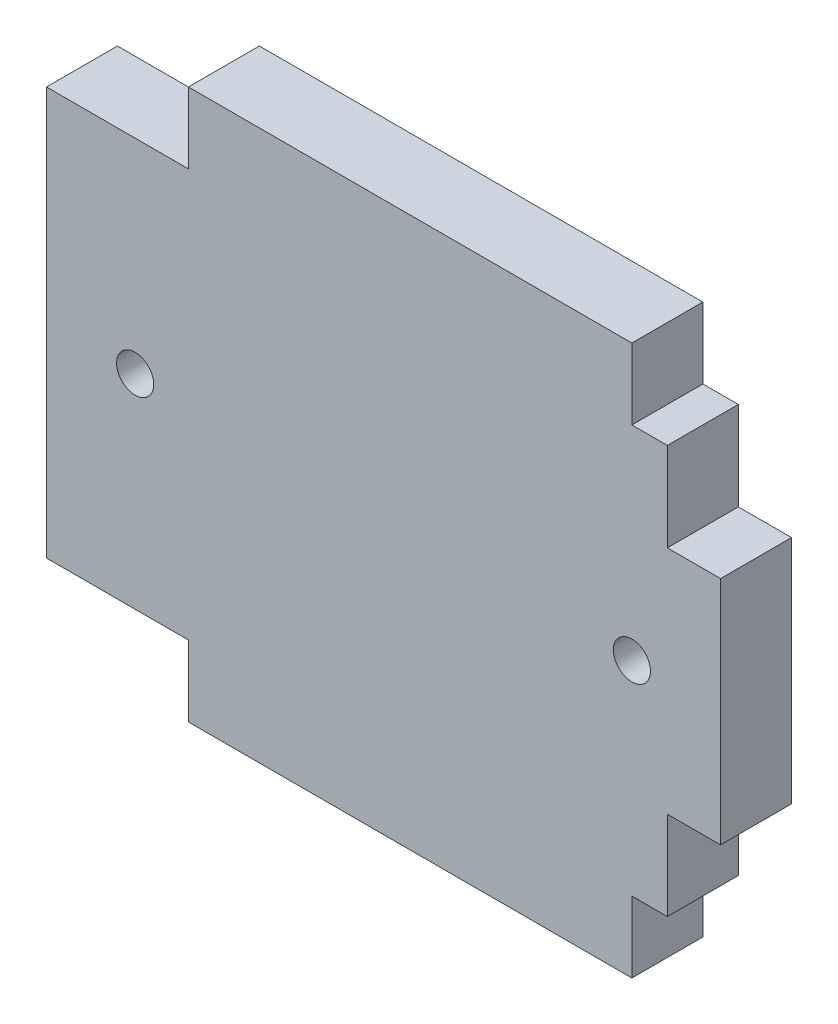
ISO-10303-21;
HEADER;
FILE_DESCRIPTION(('STEP AP214'),'2;1');
FILE_NAME('part.step','',(''),(''),'','','');
FILE_SCHEMA(('AUTOMOTIVE_DESIGN { 1 0 10303 214 1 1 1 1 }'));
ENDSEC;
DATA;
#1=APPLICATION_CONTEXT('core data for automotive mechanical design processes');
#2=APPLICATION_PROTOCOL_DEFINITION('international standard','automotive_design',2000,#1);
#3=PRODUCT_CONTEXT('',#1,'mechanical');
#4=PRODUCT('Part','Part','',(#3));
#5=PRODUCT_RELATED_PRODUCT_CATEGORY('part','',(#4));
#6=PRODUCT_DEFINITION_FORMATION('','',#4);
#7=PRODUCT_DEFINITION_CONTEXT('part definition',#1,'design');
#8=PRODUCT_DEFINITION('design','',#6,#7);
#9=PRODUCT_DEFINITION_SHAPE('','',#8);
#10=(LENGTH_UNIT() NAMED_UNIT(*) SI_UNIT(.MILLI.,.METRE.));
#11=(NAMED_UNIT(*) PLANE_ANGLE_UNIT() SI_UNIT($,.RADIAN.));
#12=(NAMED_UNIT(*) SI_UNIT($,.STERADIAN.) SOLID_ANGLE_UNIT());
#13=UNCERTAINTY_MEASURE_WITH_UNIT(LENGTH_MEASURE(1.E-05),#10,'distance_accuracy_value','');
#14=(GEOMETRIC_REPRESENTATION_CONTEXT(3) GLOBAL_UNCERTAINTY_ASSIGNED_CONTEXT((#13)) GLOBAL_UNIT_ASSIGNED_CONTEXT((#10,
#11,#12)) REPRESENTATION_CONTEXT('',''));
#15=CARTESIAN_POINT('',(0.,0.,0.));
#16=DIRECTION('',(0.,0.,1.));
#17=DIRECTION('',(1.,0.,0.));
#18=AXIS2_PLACEMENT_3D('',#15,#16,#17);
#19=CARTESIAN_POINT('',(-34.9999999999771,0.,4.));
#20=DIRECTION('',(1.,0.,0.));
#21=DIRECTION('',(0.,0.,-1.));
#22=AXIS2_PLACEMENT_3D('',#19,#20,#21);
#23=PLANE('',#22);
#24=DIRECTION('',(0.,-1.,0.));
#25=VECTOR('',#24,1.);
#26=CARTESIAN_POINT('',(-34.9999999999771,0.,0.));
#27=LINE('',#26,#25);
#28=CARTESIAN_POINT('',(-34.9999999999771,0.,0.));
#29=VERTEX_POINT('',#28);
#30=CARTESIAN_POINT('',(-34.9999999999771,-4.00000000000001,0.));
#31=VERTEX_POINT('',#30);
#32=EDGE_CURVE('E179',#29,#31,#27,.T.);
#33=ORIENTED_EDGE('',*,*,#32,.T.);
#34=DIRECTION('',(0.,0.,-1.));
#35=VECTOR('',#34,1.);
#36=CARTESIAN_POINT('',(-34.9999999999771,-4.00000000000001,4.));
#37=LINE('',#36,#35);
#38=CARTESIAN_POINT('',(-34.9999999999771,-4.00000000000001,4.));
#39=VERTEX_POINT('',#38);
#40=EDGE_CURVE('E11',#39,#31,#37,.T.);
#41=ORIENTED_EDGE('',*,*,#40,.F.);
#42=DIRECTION('',(0.,-1.,0.));
#43=VECTOR('',#42,1.);
#44=CARTESIAN_POINT('',(-34.9999999999771,0.,4.));
#45=LINE('',#44,#43);
#46=CARTESIAN_POINT('',(-34.9999999999771,0.,4.));
#47=VERTEX_POINT('',#46);
#48=EDGE_CURVE('E218',#47,#39,#45,.T.);
#49=ORIENTED_EDGE('',*,*,#48,.F.);
#50=DIRECTION('',(0.,0.,-1.));
#51=VECTOR('',#50,1.);
#52=CARTESIAN_POINT('',(-34.9999999999771,0.,4.));
#53=LINE('',#52,#51);
#54=EDGE_CURVE('E49',#47,#29,#53,.T.);
#55=ORIENTED_EDGE('',*,*,#54,.T.);
#56=EDGE_LOOP('',(#33,#41,#49,#55));
#57=FACE_BOUND('',#56,.T.);
#58=ADVANCED_FACE('F33',(#57),#23,.F.);
#59=CARTESIAN_POINT('',(-34.9999999999771,-4.00000000000001,4.));
#60=DIRECTION('',(0.,-1.,0.));
#61=DIRECTION('',(1.,0.,0.));
#62=AXIS2_PLACEMENT_3D('',#59,#60,#61);
#63=PLANE('',#62);
#64=DIRECTION('',(-1.,0.,0.));
#65=VECTOR('',#64,1.);
#66=CARTESIAN_POINT('',(-34.9999999999771,-4.00000000000001,0.));
#67=LINE('',#66,#65);
#68=CARTESIAN_POINT('',(-42.9999999999771,-4.00000000000001,0.));
#69=VERTEX_POINT('',#68);
#70=EDGE_CURVE('E181',#31,#69,#67,.T.);
#71=ORIENTED_EDGE('',*,*,#70,.T.);
#72=DIRECTION('',(0.,0.,-1.));
#73=VECTOR('',#72,1.);
#74=CARTESIAN_POINT('',(-42.9999999999771,-4.00000000000001,4.));
#75=LINE('',#74,#73);
#76=CARTESIAN_POINT('',(-42.9999999999771,-4.00000000000001,4.));
#77=VERTEX_POINT('',#76);
#78=EDGE_CURVE('E41',#77,#69,#75,.T.);
#79=ORIENTED_EDGE('',*,*,#78,.F.);
#80=DIRECTION('',(-1.,0.,0.));
#81=VECTOR('',#80,1.);
#82=CARTESIAN_POINT('',(-34.9999999999771,-4.00000000000001,4.));
#83=LINE('',#82,#81);
#84=EDGE_CURVE('E111',#39,#77,#83,.T.);
#85=ORIENTED_EDGE('',*,*,#84,.F.);
#86=ORIENTED_EDGE('',*,*,#40,.T.);
#87=EDGE_LOOP('',(#71,#79,#85,#86));
#88=FACE_BOUND('',#87,.T.);
#89=ADVANCED_FACE('F252',(#88),#63,.F.);
#90=CARTESIAN_POINT('',(-42.9999999999771,-27.,4.));
#91=DIRECTION('',(-1.,0.,0.));
#92=DIRECTION('',(0.,0.,1.));
#93=AXIS2_PLACEMENT_3D('',#90,#91,#92);
#94=PLANE('',#93);
#95=DIRECTION('',(0.,1.,0.));
#96=VECTOR('',#95,1.);
#97=CARTESIAN_POINT('',(-42.9999999999771,-27.,0.));
#98=LINE('',#97,#96);
#99=CARTESIAN_POINT('',(-42.9999999999771,-27.,0.));
#100=VERTEX_POINT('',#99);
#101=EDGE_CURVE('E185',#100,#69,#98,.T.);
#102=ORIENTED_EDGE('',*,*,#101,.F.);
#103=DIRECTION('',(0.,0.,-1.));
#104=VECTOR('',#103,1.);
#105=CARTESIAN_POINT('',(-42.9999999999771,-27.,4.));
#106=LINE('',#105,#104);
#107=CARTESIAN_POINT('',(-42.9999999999771,-27.,4.));
#108=VERTEX_POINT('',#107);
#109=EDGE_CURVE('E245',#108,#100,#106,.T.);
#110=ORIENTED_EDGE('',*,*,#109,.F.);
#111=DIRECTION('',(0.,1.,0.));
#112=VECTOR('',#111,1.);
#113=CARTESIAN_POINT('',(-42.9999999999771,-27.,4.));
#114=LINE('',#113,#112);
#115=EDGE_CURVE('E251',#108,#77,#114,.T.);
#116=ORIENTED_EDGE('',*,*,#115,.T.);
#117=ORIENTED_EDGE('',*,*,#78,.T.);
#118=EDGE_LOOP('',(#102,#110,#116,#117));
#119=FACE_BOUND('',#118,.T.);
#120=ADVANCED_FACE('F249',(#119),#94,.T.);
#121=CARTESIAN_POINT('',(-34.9999999999765,-27.,4.));
#122=DIRECTION('',(0.,-1.,0.));
#123=DIRECTION('',(1.,0.,0.));
#124=AXIS2_PLACEMENT_3D('',#121,#122,#123);
#125=PLANE('',#124);
#126=DIRECTION('',(-1.,0.,0.));
#127=VECTOR('',#126,1.);
#128=CARTESIAN_POINT('',(-34.9999999999765,-27.,0.));
#129=LINE('',#128,#127);
#130=CARTESIAN_POINT('',(-34.9999999999765,-27.,0.));
#131=VERTEX_POINT('',#130);
#132=EDGE_CURVE('E188',#131,#100,#129,.T.);
#133=ORIENTED_EDGE('',*,*,#132,.F.);
#134=DIRECTION('',(0.,0.,-1.));
#135=VECTOR('',#134,1.);
#136=CARTESIAN_POINT('',(-34.9999999999765,-27.,4.));
#137=LINE('',#136,#135);
#138=CARTESIAN_POINT('',(-34.9999999999765,-27.,4.));
#139=VERTEX_POINT('',#138);
#140=EDGE_CURVE('E243',#139,#131,#137,.T.);
#141=ORIENTED_EDGE('',*,*,#140,.F.);
#142=DIRECTION('',(-1.,0.,0.));
#143=VECTOR('',#142,1.);
#144=CARTESIAN_POINT('',(-34.9999999999765,-27.,4.));
#145=LINE('',#144,#143);
#146=EDGE_CURVE('E263',#139,#108,#145,.T.);
#147=ORIENTED_EDGE('',*,*,#146,.T.);
#148=ORIENTED_EDGE('',*,*,#109,.T.);
#149=EDGE_LOOP('',(#133,#141,#147,#148));
#150=FACE_BOUND('',#149,.T.);
#151=ADVANCED_FACE('F260',(#150),#125,.T.);
#152=CARTESIAN_POINT('',(-34.9999999999765,-31.,4.));
#153=DIRECTION('',(-1.,0.,0.));
#154=DIRECTION('',(0.,0.,1.));
#155=AXIS2_PLACEMENT_3D('',#152,#153,#154);
#156=PLANE('',#155);
#157=DIRECTION('',(0.,1.,0.));
#158=VECTOR('',#157,1.);
#159=CARTESIAN_POINT('',(-34.9999999999765,-31.,0.));
#160=LINE('',#159,#158);
#161=CARTESIAN_POINT('',(-34.9999999999765,-31.,0.));
#162=VERTEX_POINT('',#161);
#163=EDGE_CURVE('E191',#162,#131,#160,.T.);
#164=ORIENTED_EDGE('',*,*,#163,.F.);
#165=DIRECTION('',(0.,0.,-1.));
#166=VECTOR('',#165,1.);
#167=CARTESIAN_POINT('',(-34.9999999999765,-31.,4.));
#168=LINE('',#167,#166);
#169=CARTESIAN_POINT('',(-34.9999999999765,-31.,4.));
#170=VERTEX_POINT('',#169);
#171=EDGE_CURVE('E241',#170,#162,#168,.T.);
#172=ORIENTED_EDGE('',*,*,#171,.F.);
#173=DIRECTION('',(0.,1.,0.));
#174=VECTOR('',#173,1.);
#175=CARTESIAN_POINT('',(-34.9999999999765,-31.,4.));
#176=LINE('',#175,#174);
#177=EDGE_CURVE('E267',#170,#139,#176,.T.);
#178=ORIENTED_EDGE('',*,*,#177,.T.);
#179=ORIENTED_EDGE('',*,*,#140,.T.);
#180=EDGE_LOOP('',(#164,#172,#178,#179));
#181=FACE_BOUND('',#180,.T.);
#182=ADVANCED_FACE('F451',(#181),#156,.T.);
#183=CARTESIAN_POINT('',(-34.9999999999765,-31.,4.));
#184=DIRECTION('',(0.,1.,0.));
#185=DIRECTION('',(0.,0.,1.));
#186=AXIS2_PLACEMENT_3D('',#183,#184,#185);
#187=PLANE('',#186);
#188=DIRECTION('',(1.,0.,0.));
#189=VECTOR('',#188,1.);
#190=CARTESIAN_POINT('',(-34.9999999999765,-31.,0.));
#191=LINE('',#190,#189);
#192=CARTESIAN_POINT('',(-9.99999999997645,-31.,0.));
#193=VERTEX_POINT('',#192);
#194=EDGE_CURVE('E194',#162,#193,#191,.T.);
#195=ORIENTED_EDGE('',*,*,#194,.T.);
#196=DIRECTION('',(0.,0.,-1.));
#197=VECTOR('',#196,1.);
#198=CARTESIAN_POINT('',(-9.99999999997645,-31.,4.));
#199=LINE('',#198,#197);
#200=CARTESIAN_POINT('',(-9.99999999997645,-31.,4.));
#201=VERTEX_POINT('',#200);
#202=EDGE_CURVE('E238',#201,#193,#199,.T.);
#203=ORIENTED_EDGE('',*,*,#202,.F.);
#204=DIRECTION('',(1.,0.,0.));
#205=VECTOR('',#204,1.);
#206=CARTESIAN_POINT('',(-34.9999999999765,-31.,4.));
#207=LINE('',#206,#205);
#208=EDGE_CURVE('E273',#170,#201,#207,.T.);
#209=ORIENTED_EDGE('',*,*,#208,.F.);
#210=ORIENTED_EDGE('',*,*,#171,.T.);
#211=EDGE_LOOP('',(#195,#203,#209,#210));
#212=FACE_BOUND('',#211,.T.);
#213=ADVANCED_FACE('F441',(#212),#187,.F.);
#214=CARTESIAN_POINT('',(-9.99999999997645,-31.,4.));
#215=DIRECTION('',(-1.,0.,0.));
#216=DIRECTION('',(0.,0.,1.));
#217=AXIS2_PLACEMENT_3D('',#214,#215,#216);
#218=PLANE('',#217);
#219=DIRECTION('',(0.,1.,0.));
#220=VECTOR('',#219,1.);
#221=CARTESIAN_POINT('',(-9.99999999997645,-31.,0.));
#222=LINE('',#221,#220);
#223=CARTESIAN_POINT('',(-9.99999999997645,-27.,0.));
#224=VERTEX_POINT('',#223);
#225=EDGE_CURVE('E196',#193,#224,#222,.T.);
#226=ORIENTED_EDGE('',*,*,#225,.T.);
#227=DIRECTION('',(0.,0.,-1.));
#228=VECTOR('',#227,1.);
#229=CARTESIAN_POINT('',(-9.99999999997645,-27.,4.));
#230=LINE('',#229,#228);
#231=CARTESIAN_POINT('',(-9.99999999997645,-27.,4.));
#232=VERTEX_POINT('',#231);
#233=EDGE_CURVE('E235',#232,#224,#230,.T.);
#234=ORIENTED_EDGE('',*,*,#233,.F.);
#235=DIRECTION('',(0.,1.,0.));
#236=VECTOR('',#235,1.);
#237=CARTESIAN_POINT('',(-9.99999999997645,-31.,4.));
#238=LINE('',#237,#236);
#239=EDGE_CURVE('E275',#201,#232,#238,.T.);
#240=ORIENTED_EDGE('',*,*,#239,.F.);
#241=ORIENTED_EDGE('',*,*,#202,.T.);
#242=EDGE_LOOP('',(#226,#234,#240,#241));
#243=FACE_BOUND('',#242,.T.);
#244=ADVANCED_FACE('F431',(#243),#218,.F.);
#245=CARTESIAN_POINT('',(-9.99999999997645,-27.,4.));
#246=DIRECTION('',(0.,1.,0.));
#247=DIRECTION('',(-1.,0.,0.));
#248=AXIS2_PLACEMENT_3D('',#245,#246,#247);
#249=PLANE('',#248);
#250=DIRECTION('',(1.,0.,0.));
#251=VECTOR('',#250,1.);
#252=CARTESIAN_POINT('',(-9.99999999997645,-27.,0.));
#253=LINE('',#252,#251);
#254=CARTESIAN_POINT('',(-7.99999999997709,-27.,0.));
#255=VERTEX_POINT('',#254);
#256=EDGE_CURVE('E198',#224,#255,#253,.T.);
#257=ORIENTED_EDGE('',*,*,#256,.T.);
#258=DIRECTION('',(0.,0.,-1.));
#259=VECTOR('',#258,1.);
#260=CARTESIAN_POINT('',(-7.99999999997709,-27.,4.));
#261=LINE('',#260,#259);
#262=CARTESIAN_POINT('',(-7.99999999997709,-27.,4.));
#263=VERTEX_POINT('',#262);
#264=EDGE_CURVE('E232',#263,#255,#261,.T.);
#265=ORIENTED_EDGE('',*,*,#264,.F.);
#266=DIRECTION('',(1.,0.,0.));
#267=VECTOR('',#266,1.);
#268=CARTESIAN_POINT('',(-9.99999999997645,-27.,4.));
#269=LINE('',#268,#267);
#270=EDGE_CURVE('E277',#232,#263,#269,.T.);
#271=ORIENTED_EDGE('',*,*,#270,.F.);
#272=ORIENTED_EDGE('',*,*,#233,.T.);
#273=EDGE_LOOP('',(#257,#265,#271,#272));
#274=FACE_BOUND('',#273,.T.);
#275=ADVANCED_FACE('F421',(#274),#249,.F.);
#276=CARTESIAN_POINT('',(-7.99999999997709,-27.,4.));
#277=DIRECTION('',(-1.,0.,0.));
#278=DIRECTION('',(0.,0.,1.));
#279=AXIS2_PLACEMENT_3D('',#276,#277,#278);
#280=PLANE('',#279);
#281=DIRECTION('',(0.,1.,0.));
#282=VECTOR('',#281,1.);
#283=CARTESIAN_POINT('',(-7.99999999997709,-27.,0.));
#284=LINE('',#283,#282);
#285=CARTESIAN_POINT('',(-7.99999999997709,-21.9999999999994,0.));
#286=VERTEX_POINT('',#285);
#287=EDGE_CURVE('E200',#255,#286,#284,.T.);
#288=ORIENTED_EDGE('',*,*,#287,.T.);
#289=DIRECTION('',(0.,0.,-1.));
#290=VECTOR('',#289,1.);
#291=CARTESIAN_POINT('',(-7.99999999997709,-21.9999999999994,4.));
#292=LINE('',#291,#290);
#293=CARTESIAN_POINT('',(-7.99999999997709,-21.9999999999994,4.));
#294=VERTEX_POINT('',#293);
#295=EDGE_CURVE('E229',#294,#286,#292,.T.);
#296=ORIENTED_EDGE('',*,*,#295,.F.);
#297=DIRECTION('',(0.,1.,0.));
#298=VECTOR('',#297,1.);
#299=CARTESIAN_POINT('',(-7.99999999997709,-27.,4.));
#300=LINE('',#299,#298);
#301=EDGE_CURVE('E279',#263,#294,#300,.T.);
#302=ORIENTED_EDGE('',*,*,#301,.F.);
#303=ORIENTED_EDGE('',*,*,#264,.T.);
#304=EDGE_LOOP('',(#288,#296,#302,#303));
#305=FACE_BOUND('',#304,.T.);
#306=ADVANCED_FACE('F411',(#305),#280,.F.);
#307=CARTESIAN_POINT('',(-7.99999999997709,-21.9999999999994,4.));
#308=DIRECTION('',(0.,1.,0.));
#309=DIRECTION('',(0.,0.,1.));
#310=AXIS2_PLACEMENT_3D('',#307,#308,#309);
#311=PLANE('',#310);
#312=DIRECTION('',(1.,0.,0.));
#313=VECTOR('',#312,1.);
#314=CARTESIAN_POINT('',(-7.99999999997709,-21.9999999999994,0.));
#315=LINE('',#314,#313);
#316=CARTESIAN_POINT('',(-4.99999999997709,-21.9999999999994,0.));
#317=VERTEX_POINT('',#316);
#318=EDGE_CURVE('E202',#286,#317,#315,.T.);
#319=ORIENTED_EDGE('',*,*,#318,.T.);
#320=DIRECTION('',(0.,0.,-1.));
#321=VECTOR('',#320,1.);
#322=CARTESIAN_POINT('',(-4.99999999997709,-21.9999999999994,4.));
#323=LINE('',#322,#321);
#324=CARTESIAN_POINT('',(-4.99999999997709,-21.9999999999994,4.));
#325=VERTEX_POINT('',#324);
#326=EDGE_CURVE('E226',#325,#317,#323,.T.);
#327=ORIENTED_EDGE('',*,*,#326,.F.);
#328=DIRECTION('',(1.,0.,0.));
#329=VECTOR('',#328,1.);
#330=CARTESIAN_POINT('',(-7.99999999997709,-21.9999999999994,4.));
#331=LINE('',#330,#329);
#332=EDGE_CURVE('E281',#294,#325,#331,.T.);
#333=ORIENTED_EDGE('',*,*,#332,.F.);
#334=ORIENTED_EDGE('',*,*,#295,.T.);
#335=EDGE_LOOP('',(#319,#327,#333,#334));
#336=FACE_BOUND('',#335,.T.);
#337=ADVANCED_FACE('F402',(#336),#311,.F.);
#338=CARTESIAN_POINT('',(-4.99999999997709,-21.9999999999994,4.));
#339=DIRECTION('',(-1.,0.,0.));
#340=DIRECTION('',(0.,-1.,0.));
#341=AXIS2_PLACEMENT_3D('',#338,#339,#340);
#342=PLANE('',#341);
#343=DIRECTION('',(0.,1.,0.));
#344=VECTOR('',#343,1.);
#345=CARTESIAN_POINT('',(-4.99999999997709,-21.9999999999994,0.));
#346=LINE('',#345,#344);
#347=CARTESIAN_POINT('',(-4.99999999997714,-9.00000000000006,0.));
#348=VERTEX_POINT('',#347);
#349=EDGE_CURVE('E204',#317,#348,#346,.T.);
#350=ORIENTED_EDGE('',*,*,#349,.T.);
#351=DIRECTION('',(0.,0.,-1.));
#352=VECTOR('',#351,1.);
#353=CARTESIAN_POINT('',(-4.99999999997714,-9.00000000000006,4.));
#354=LINE('',#353,#352);
#355=CARTESIAN_POINT('',(-4.99999999997714,-9.00000000000006,4.));
#356=VERTEX_POINT('',#355);
#357=EDGE_CURVE('E224',#356,#348,#354,.T.);
#358=ORIENTED_EDGE('',*,*,#357,.F.);
#359=DIRECTION('',(0.,1.,0.));
#360=VECTOR('',#359,1.);
#361=CARTESIAN_POINT('',(-4.99999999997709,-21.9999999999994,4.));
#362=LINE('',#361,#360);
#363=EDGE_CURVE('E283',#325,#356,#362,.T.);
#364=ORIENTED_EDGE('',*,*,#363,.F.);
#365=ORIENTED_EDGE('',*,*,#326,.T.);
#366=EDGE_LOOP('',(#350,#358,#364,#365));
#367=FACE_BOUND('',#366,.T.);
#368=ADVANCED_FACE('F295',(#367),#342,.F.);
#369=CARTESIAN_POINT('',(-7.99999999997709,-9.00000000000006,4.));
#370=DIRECTION('',(0.,1.,0.));
#371=DIRECTION('',(-1.,0.,0.));
#372=AXIS2_PLACEMENT_3D('',#369,#370,#371);
#373=PLANE('',#372);
#374=DIRECTION('',(1.,0.,0.));
#375=VECTOR('',#374,1.);
#376=CARTESIAN_POINT('',(-7.99999999997709,-9.00000000000006,0.));
#377=LINE('',#376,#375);
#378=CARTESIAN_POINT('',(-7.99999999997709,-9.00000000000006,0.));
#379=VERTEX_POINT('',#378);
#380=EDGE_CURVE('E207',#379,#348,#377,.T.);
#381=ORIENTED_EDGE('',*,*,#380,.F.);
#382=DIRECTION('',(0.,0.,-1.));
#383=VECTOR('',#382,1.);
#384=CARTESIAN_POINT('',(-7.99999999997709,-9.00000000000006,4.));
#385=LINE('',#384,#383);
#386=CARTESIAN_POINT('',(-7.99999999997709,-9.00000000000006,4.));
#387=VERTEX_POINT('',#386);
#388=EDGE_CURVE('E222',#387,#379,#385,.T.);
#389=ORIENTED_EDGE('',*,*,#388,.F.);
#390=DIRECTION('',(1.,0.,0.));
#391=VECTOR('',#390,1.);
#392=CARTESIAN_POINT('',(-7.99999999997709,-9.00000000000006,4.));
#393=LINE('',#392,#391);
#394=EDGE_CURVE('E285',#387,#356,#393,.T.);
#395=ORIENTED_EDGE('',*,*,#394,.T.);
#396=ORIENTED_EDGE('',*,*,#357,.T.);
#397=EDGE_LOOP('',(#381,#389,#395,#396));
#398=FACE_BOUND('',#397,.T.);
#399=ADVANCED_FACE('F289',(#398),#373,.T.);
#400=CARTESIAN_POINT('',(-7.99999999997709,-9.00000000000006,4.));
#401=DIRECTION('',(-1.,0.,0.));
#402=DIRECTION('',(0.,0.,1.));
#403=AXIS2_PLACEMENT_3D('',#400,#401,#402);
#404=PLANE('',#403);
#405=DIRECTION('',(0.,1.,0.));
#406=VECTOR('',#405,1.);
#407=CARTESIAN_POINT('',(-7.99999999997709,-9.00000000000006,0.));
#408=LINE('',#407,#406);
#409=CARTESIAN_POINT('',(-7.99999999997709,-4.00000000000002,0.));
#410=VERTEX_POINT('',#409);
#411=EDGE_CURVE('E210',#379,#410,#408,.T.);
#412=ORIENTED_EDGE('',*,*,#411,.T.);
#413=DIRECTION('',(0.,0.,-1.));
#414=VECTOR('',#413,1.);
#415=CARTESIAN_POINT('',(-7.99999999997709,-4.00000000000002,4.));
#416=LINE('',#415,#414);
#417=CARTESIAN_POINT('',(-7.99999999997709,-4.00000000000002,4.));
#418=VERTEX_POINT('',#417);
#419=EDGE_CURVE('E171',#418,#410,#416,.T.);
#420=ORIENTED_EDGE('',*,*,#419,.F.);
#421=DIRECTION('',(0.,1.,0.));
#422=VECTOR('',#421,1.);
#423=CARTESIAN_POINT('',(-7.99999999997709,-9.00000000000006,4.));
#424=LINE('',#423,#422);
#425=EDGE_CURVE('E159',#387,#418,#424,.T.);
#426=ORIENTED_EDGE('',*,*,#425,.F.);
#427=ORIENTED_EDGE('',*,*,#388,.T.);
#428=EDGE_LOOP('',(#412,#420,#426,#427));
#429=FACE_BOUND('',#428,.T.);
#430=ADVANCED_FACE('F300',(#429),#404,.F.);
#431=CARTESIAN_POINT('',(-7.99999999997709,-4.00000000000002,4.));
#432=DIRECTION('',(0.,-1.,0.));
#433=DIRECTION('',(1.,0.,0.));
#434=AXIS2_PLACEMENT_3D('',#431,#432,#433);
#435=PLANE('',#434);
#436=DIRECTION('',(-1.,0.,0.));
#437=VECTOR('',#436,1.);
#438=CARTESIAN_POINT('',(-7.99999999997709,-4.00000000000002,0.));
#439=LINE('',#438,#437);
#440=CARTESIAN_POINT('',(-9.99999999997715,-4.00000000000001,0.));
#441=VERTEX_POINT('',#440);
#442=EDGE_CURVE('E168',#410,#441,#439,.T.);
#443=ORIENTED_EDGE('',*,*,#442,.T.);
#444=DIRECTION('',(0.,0.,-1.));
#445=VECTOR('',#444,1.);
#446=CARTESIAN_POINT('',(-9.99999999997715,-4.00000000000001,4.));
#447=LINE('',#446,#445);
#448=CARTESIAN_POINT('',(-9.99999999997715,-4.00000000000001,4.));
#449=VERTEX_POINT('',#448);
#450=EDGE_CURVE('E165',#449,#441,#447,.T.);
#451=ORIENTED_EDGE('',*,*,#450,.F.);
#452=DIRECTION('',(-1.,0.,0.));
#453=VECTOR('',#452,1.);
#454=CARTESIAN_POINT('',(-7.99999999997709,-4.00000000000002,4.));
#455=LINE('',#454,#453);
#456=EDGE_CURVE('E151',#418,#449,#455,.T.);
#457=ORIENTED_EDGE('',*,*,#456,.F.);
#458=ORIENTED_EDGE('',*,*,#419,.T.);
#459=EDGE_LOOP('',(#443,#451,#457,#458));
#460=FACE_BOUND('',#459,.T.);
#461=ADVANCED_FACE('F166',(#460),#435,.F.);
#462=CARTESIAN_POINT('',(-9.99999999997715,0.,4.));
#463=DIRECTION('',(1.,0.,0.));
#464=DIRECTION('',(0.,0.,-1.));
#465=AXIS2_PLACEMENT_3D('',#462,#463,#464);
#466=PLANE('',#465);
#467=DIRECTION('',(0.,-1.,0.));
#468=VECTOR('',#467,1.);
#469=CARTESIAN_POINT('',(-9.99999999997715,0.,0.));
#470=LINE('',#469,#468);
#471=CARTESIAN_POINT('',(-9.99999999997715,0.,0.));
#472=VERTEX_POINT('',#471);
#473=EDGE_CURVE('E213',#472,#441,#470,.T.);
#474=ORIENTED_EDGE('',*,*,#473,.F.);
#475=DIRECTION('',(0.,0.,-1.));
#476=VECTOR('',#475,1.);
#477=CARTESIAN_POINT('',(-9.99999999997715,0.,4.));
#478=LINE('',#477,#476);
#479=CARTESIAN_POINT('',(-9.99999999997715,0.,4.));
#480=VERTEX_POINT('',#479);
#481=EDGE_CURVE('E99',#480,#472,#478,.T.);
#482=ORIENTED_EDGE('',*,*,#481,.F.);
#483=DIRECTION('',(0.,-1.,0.));
#484=VECTOR('',#483,1.);
#485=CARTESIAN_POINT('',(-9.99999999997715,0.,4.));
#486=LINE('',#485,#484);
#487=EDGE_CURVE('E156',#480,#449,#486,.T.);
#488=ORIENTED_EDGE('',*,*,#487,.T.);
#489=ORIENTED_EDGE('',*,*,#450,.T.);
#490=EDGE_LOOP('',(#474,#482,#488,#489));
#491=FACE_BOUND('',#490,.T.);
#492=ADVANCED_FACE('F173',(#491),#466,.T.);
#493=CARTESIAN_POINT('',(-34.9999999999771,0.,4.));
#494=DIRECTION('',(0.,1.,0.));
#495=DIRECTION('',(-1.,0.,0.));
#496=AXIS2_PLACEMENT_3D('',#493,#494,#495);
#497=PLANE('',#496);
#498=DIRECTION('',(1.,0.,0.));
#499=VECTOR('',#498,1.);
#500=CARTESIAN_POINT('',(-34.9999999999771,0.,0.));
#501=LINE('',#500,#499);
#502=EDGE_CURVE('E215',#29,#472,#501,.T.);
#503=ORIENTED_EDGE('',*,*,#502,.F.);
#504=ORIENTED_EDGE('',*,*,#54,.F.);
#505=DIRECTION('',(1.,0.,0.));
#506=VECTOR('',#505,1.);
#507=CARTESIAN_POINT('',(-34.9999999999771,0.,4.));
#508=LINE('',#507,#506);
#509=EDGE_CURVE('E174',#47,#480,#508,.T.);
#510=ORIENTED_EDGE('',*,*,#509,.T.);
#511=ORIENTED_EDGE('',*,*,#481,.T.);
#512=EDGE_LOOP('',(#503,#504,#510,#511));
#513=FACE_BOUND('',#512,.T.);
#514=ADVANCED_FACE('F313',(#513),#497,.T.);
#515=CARTESIAN_POINT('',(0.,0.,4.));
#516=DIRECTION('',(0.,0.,-1.));
#517=DIRECTION('',(-1.,0.,0.));
#518=AXIS2_PLACEMENT_3D('',#515,#516,#517);
#519=PLANE('',#518);
#520=CARTESIAN_POINT('',(-9.99824999989643,-15.4999999999923,4.));
#521=DIRECTION('',(0.,0.,1.));
#522=DIRECTION('',(1.,0.,0.));
#523=AXIS2_PLACEMENT_3D('',#520,#521,#522);
#524=CIRCLE('',#523,1.04774999992191);
#525=CARTESIAN_POINT('',(-8.95049999997452,-15.4999999999923,4.));
#526=VERTEX_POINT('',#525);
#527=EDGE_CURVE('E342',#526,#526,#524,.T.);
#528=ORIENTED_EDGE('',*,*,#527,.F.);
#529=EDGE_LOOP('',(#528));
#530=FACE_BOUND('',#529,.T.);
#531=CARTESIAN_POINT('',(-38.0017499998964,-15.4999999999923,4.));
#532=DIRECTION('',(0.,0.,1.));
#533=DIRECTION('',(1.,0.,0.));
#534=AXIS2_PLACEMENT_3D('',#531,#532,#533);
#535=CIRCLE('',#534,1.04774999992191);
#536=CARTESIAN_POINT('',(-36.9539999999745,-15.4999999999923,4.));
#537=VERTEX_POINT('',#536);
#538=EDGE_CURVE('E182',#537,#537,#535,.T.);
#539=ORIENTED_EDGE('',*,*,#538,.F.);
#540=EDGE_LOOP('',(#539));
#541=FACE_BOUND('',#540,.T.);
#542=ORIENTED_EDGE('',*,*,#48,.T.);
#543=ORIENTED_EDGE('',*,*,#84,.T.);
#544=ORIENTED_EDGE('',*,*,#115,.F.);
#545=ORIENTED_EDGE('',*,*,#146,.F.);
#546=ORIENTED_EDGE('',*,*,#177,.F.);
#547=ORIENTED_EDGE('',*,*,#208,.T.);
#548=ORIENTED_EDGE('',*,*,#239,.T.);
#549=ORIENTED_EDGE('',*,*,#270,.T.);
#550=ORIENTED_EDGE('',*,*,#301,.T.);
#551=ORIENTED_EDGE('',*,*,#332,.T.);
#552=ORIENTED_EDGE('',*,*,#363,.T.);
#553=ORIENTED_EDGE('',*,*,#394,.F.);
#554=ORIENTED_EDGE('',*,*,#425,.T.);
#555=ORIENTED_EDGE('',*,*,#456,.T.);
#556=ORIENTED_EDGE('',*,*,#487,.F.);
#557=ORIENTED_EDGE('',*,*,#509,.F.);
#558=EDGE_LOOP('',(#542,#543,#544,#545,#546,#547,#548,#549,#550,#551,#552,#553,#554,#555,#556,#557));
#559=FACE_BOUND('',#558,.T.);
#560=ADVANCED_FACE('F153',(#530,#541,#559),#519,.F.);
#561=CARTESIAN_POINT('',(0.,0.,0.));
#562=DIRECTION('',(0.,0.,-1.));
#563=DIRECTION('',(-1.,0.,0.));
#564=AXIS2_PLACEMENT_3D('',#561,#562,#563);
#565=PLANE('',#564);
#566=CARTESIAN_POINT('',(-9.99824999989643,-15.4999999999923,0.));
#567=DIRECTION('',(0.,0.,-1.));
#568=DIRECTION('',(-1.,0.,0.));
#569=AXIS2_PLACEMENT_3D('',#566,#567,#568);
#570=CIRCLE('',#569,1.04774999992191);
#571=CARTESIAN_POINT('',(-11.0459999998183,-15.4999999999923,0.));
#572=VERTEX_POINT('',#571);
#573=EDGE_CURVE('E339',#572,#572,#570,.F.);
#574=ORIENTED_EDGE('',*,*,#573,.T.);
#575=EDGE_LOOP('',(#574));
#576=FACE_BOUND('',#575,.T.);
#577=CARTESIAN_POINT('',(-38.0017499998964,-15.4999999999923,0.));
#578=DIRECTION('',(0.,0.,-1.));
#579=DIRECTION('',(-1.,0.,0.));
#580=AXIS2_PLACEMENT_3D('',#577,#578,#579);
#581=CIRCLE('',#580,1.04774999992191);
#582=CARTESIAN_POINT('',(-39.0494999998184,-15.4999999999923,0.));
#583=VERTEX_POINT('',#582);
#584=EDGE_CURVE('E343',#583,#583,#581,.F.);
#585=ORIENTED_EDGE('',*,*,#584,.T.);
#586=EDGE_LOOP('',(#585));
#587=FACE_BOUND('',#586,.T.);
#588=ORIENTED_EDGE('',*,*,#32,.F.);
#589=ORIENTED_EDGE('',*,*,#502,.T.);
#590=ORIENTED_EDGE('',*,*,#473,.T.);
#591=ORIENTED_EDGE('',*,*,#442,.F.);
#592=ORIENTED_EDGE('',*,*,#411,.F.);
#593=ORIENTED_EDGE('',*,*,#380,.T.);
#594=ORIENTED_EDGE('',*,*,#349,.F.);
#595=ORIENTED_EDGE('',*,*,#318,.F.);
#596=ORIENTED_EDGE('',*,*,#287,.F.);
#597=ORIENTED_EDGE('',*,*,#256,.F.);
#598=ORIENTED_EDGE('',*,*,#225,.F.);
#599=ORIENTED_EDGE('',*,*,#194,.F.);
#600=ORIENTED_EDGE('',*,*,#163,.T.);
#601=ORIENTED_EDGE('',*,*,#132,.T.);
#602=ORIENTED_EDGE('',*,*,#101,.T.);
#603=ORIENTED_EDGE('',*,*,#70,.F.);
#604=EDGE_LOOP('',(#588,#589,#590,#591,#592,#593,#594,#595,#596,#597,#598,#599,#600,#601,#602,#603));
#605=FACE_BOUND('',#604,.T.);
#606=ADVANCED_FACE('F255',(#576,#587,#605),#565,.T.);
#607=CARTESIAN_POINT('',(-38.0017499998964,-15.4999999999923,-0.00100000000000013));
#608=DIRECTION('',(0.,0.,1.));
#609=DIRECTION('',(1.,0.,0.));
#610=AXIS2_PLACEMENT_3D('',#607,#608,#609);
#611=CYLINDRICAL_SURFACE('',#610,1.04774999992191);
#612=ORIENTED_EDGE('',*,*,#584,.F.);
#613=EDGE_LOOP('',(#612));
#614=FACE_BOUND('',#613,.T.);
#615=ORIENTED_EDGE('',*,*,#538,.T.);
#616=EDGE_LOOP('',(#615));
#617=FACE_BOUND('',#616,.T.);
#618=ADVANCED_FACE('F325',(#614,#617),#611,.F.);
#619=CARTESIAN_POINT('',(-9.99824999989643,-15.4999999999923,-0.00100000000000013));
#620=DIRECTION('',(0.,0.,1.));
#621=DIRECTION('',(1.,0.,0.));
#622=AXIS2_PLACEMENT_3D('',#619,#620,#621);
#623=CYLINDRICAL_SURFACE('',#622,1.04774999992191);
#624=ORIENTED_EDGE('',*,*,#573,.F.);
#625=EDGE_LOOP('',(#624));
#626=FACE_BOUND('',#625,.T.);
#627=ORIENTED_EDGE('',*,*,#527,.T.);
#628=EDGE_LOOP('',(#627));
#629=FACE_BOUND('',#628,.T.);
#630=ADVANCED_FACE('F330',(#626,#629),#623,.F.);
#631=CLOSED_SHELL('',(#58,#89,#120,#151,#182,#213,#244,#275,#306,#337,#368,#399,#430,#461,#492,
#514,#560,#606,#618,#630));
#632=MANIFOLD_SOLID_BREP('B2',#631);
#633=ADVANCED_BREP_SHAPE_REPRESENTATION('',(#18,#632),#14);
#634=SHAPE_DEFINITION_REPRESENTATION(#9,#633);
ENDSEC;
END-ISO-10303-21;
